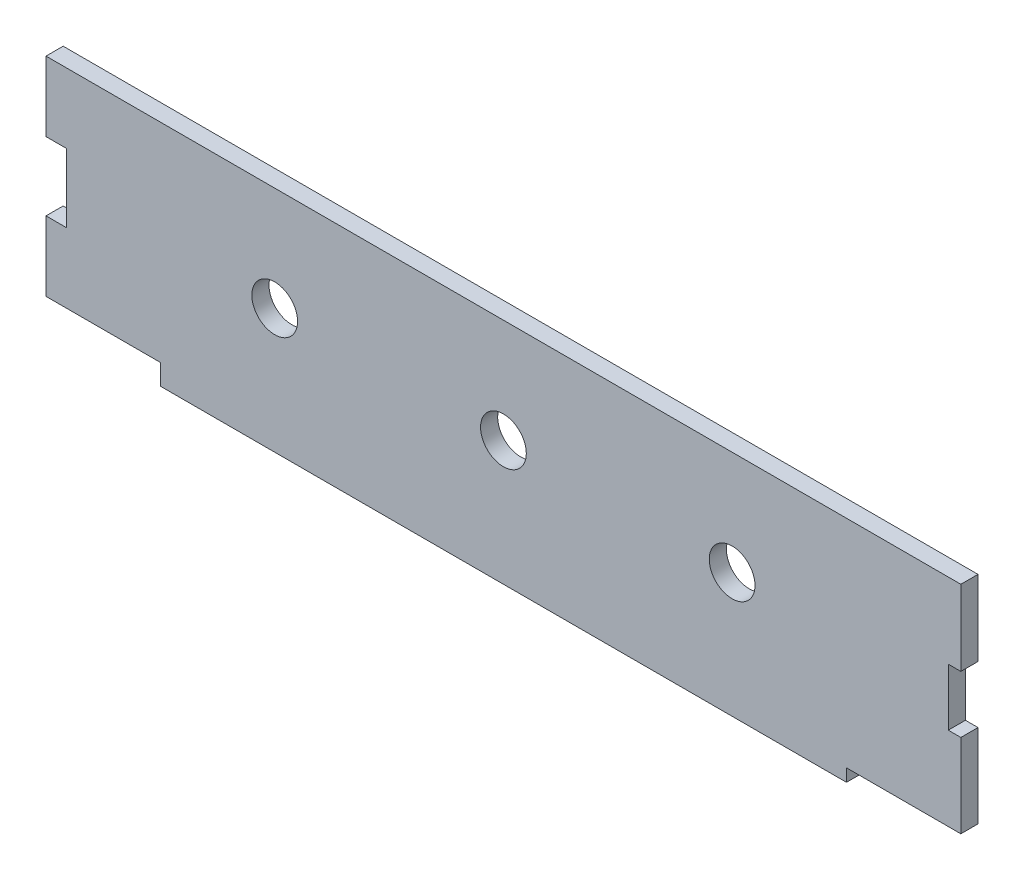
ISO-10303-21;
HEADER;
FILE_DESCRIPTION(('STEP AP214'),'2;1');
FILE_NAME('part.step','',(''),(''),'','','');
FILE_SCHEMA(('AUTOMOTIVE_DESIGN { 1 0 10303 214 1 1 1 1 }'));
ENDSEC;
DATA;
#1=APPLICATION_CONTEXT('core data for automotive mechanical design processes');
#2=APPLICATION_PROTOCOL_DEFINITION('international standard','automotive_design',2000,#1);
#3=PRODUCT_CONTEXT('',#1,'mechanical');
#4=PRODUCT('Part','Part','',(#3));
#5=PRODUCT_RELATED_PRODUCT_CATEGORY('part','',(#4));
#6=PRODUCT_DEFINITION_FORMATION('','',#4);
#7=PRODUCT_DEFINITION_CONTEXT('part definition',#1,'design');
#8=PRODUCT_DEFINITION('design','',#6,#7);
#9=PRODUCT_DEFINITION_SHAPE('','',#8);
#10=(LENGTH_UNIT() NAMED_UNIT(*) SI_UNIT(.MILLI.,.METRE.));
#11=(NAMED_UNIT(*) PLANE_ANGLE_UNIT() SI_UNIT($,.RADIAN.));
#12=(NAMED_UNIT(*) SI_UNIT($,.STERADIAN.) SOLID_ANGLE_UNIT());
#13=UNCERTAINTY_MEASURE_WITH_UNIT(LENGTH_MEASURE(1.E-05),#10,'distance_accuracy_value','');
#14=(GEOMETRIC_REPRESENTATION_CONTEXT(3) GLOBAL_UNCERTAINTY_ASSIGNED_CONTEXT((#13)) GLOBAL_UNIT_ASSIGNED_CONTEXT((#10,
#11,#12)) REPRESENTATION_CONTEXT('',''));
#15=CARTESIAN_POINT('',(0.,0.,0.));
#16=DIRECTION('',(0.,0.,1.));
#17=DIRECTION('',(1.,0.,0.));
#18=AXIS2_PLACEMENT_3D('',#15,#16,#17);
#19=CARTESIAN_POINT('',(0.,0.,1.5));
#20=DIRECTION('',(0.,0.,-1.));
#21=DIRECTION('',(-1.,0.,0.));
#22=AXIS2_PLACEMENT_3D('',#19,#20,#21);
#23=PLANE('',#22);
#24=DIRECTION('',(0.,-1.,0.));
#25=VECTOR('',#24,1.);
#26=CARTESIAN_POINT('',(-40.,2.99999999999999,1.5));
#27=LINE('',#26,#25);
#28=CARTESIAN_POINT('',(-40.0000000000001,9.09999999999999,1.5));
#29=VERTEX_POINT('',#28);
#30=CARTESIAN_POINT('',(-40.,2.99999999999999,1.5));
#31=VERTEX_POINT('',#30);
#32=EDGE_CURVE('E209',#29,#31,#27,.T.);
#33=ORIENTED_EDGE('',*,*,#32,.T.);
#34=DIRECTION('',(1.,0.,0.));
#35=VECTOR('',#34,1.);
#36=CARTESIAN_POINT('',(-38.2,2.99999999999999,1.5));
#37=LINE('',#36,#35);
#38=CARTESIAN_POINT('',(-38.2,2.99999999999999,1.5));
#39=VERTEX_POINT('',#38);
#40=EDGE_CURVE('E117',#31,#39,#37,.T.);
#41=ORIENTED_EDGE('',*,*,#40,.T.);
#42=DIRECTION('',(0.,-1.,0.));
#43=VECTOR('',#42,1.);
#44=CARTESIAN_POINT('',(-38.2,-3.00000000000001,1.5));
#45=LINE('',#44,#43);
#46=CARTESIAN_POINT('',(-38.2,-3.00000000000001,1.5));
#47=VERTEX_POINT('',#46);
#48=EDGE_CURVE('E248',#39,#47,#45,.T.);
#49=ORIENTED_EDGE('',*,*,#48,.T.);
#50=DIRECTION('',(-1.,0.,0.));
#51=VECTOR('',#50,1.);
#52=CARTESIAN_POINT('',(-40.,-3.,1.5));
#53=LINE('',#52,#51);
#54=CARTESIAN_POINT('',(-40.,-3.,1.5));
#55=VERTEX_POINT('',#54);
#56=EDGE_CURVE('E267',#47,#55,#53,.T.);
#57=ORIENTED_EDGE('',*,*,#56,.T.);
#58=DIRECTION('',(0.,-1.,0.));
#59=VECTOR('',#58,1.);
#60=CARTESIAN_POINT('',(-40.,-9.1,1.5));
#61=LINE('',#60,#59);
#62=CARTESIAN_POINT('',(-40.,-9.1,1.5));
#63=VERTEX_POINT('',#62);
#64=EDGE_CURVE('E264',#55,#63,#61,.T.);
#65=ORIENTED_EDGE('',*,*,#64,.T.);
#66=DIRECTION('',(1.,0.,0.));
#67=VECTOR('',#66,1.);
#68=CARTESIAN_POINT('',(-30.,-9.1,1.5));
#69=LINE('',#68,#67);
#70=CARTESIAN_POINT('',(-30.,-9.1,1.5));
#71=VERTEX_POINT('',#70);
#72=EDGE_CURVE('E266',#63,#71,#69,.T.);
#73=ORIENTED_EDGE('',*,*,#72,.T.);
#74=DIRECTION('',(0.,-1.,0.));
#75=VECTOR('',#74,1.);
#76=CARTESIAN_POINT('',(-30.,-10.9,1.5));
#77=LINE('',#76,#75);
#78=CARTESIAN_POINT('',(-30.,-10.9,1.5));
#79=VERTEX_POINT('',#78);
#80=EDGE_CURVE('E269',#71,#79,#77,.T.);
#81=ORIENTED_EDGE('',*,*,#80,.T.);
#82=DIRECTION('',(1.,0.,0.));
#83=VECTOR('',#82,1.);
#84=CARTESIAN_POINT('',(30.,-10.9,1.5));
#85=LINE('',#84,#83);
#86=CARTESIAN_POINT('',(30.,-10.9,1.5));
#87=VERTEX_POINT('',#86);
#88=EDGE_CURVE('E275',#79,#87,#85,.T.);
#89=ORIENTED_EDGE('',*,*,#88,.T.);
#90=DIRECTION('',(0.,1.,0.));
#91=VECTOR('',#90,1.);
#92=CARTESIAN_POINT('',(30.,-9.79999999999999,1.5));
#93=LINE('',#92,#91);
#94=CARTESIAN_POINT('',(30.,-9.79999999999999,1.5));
#95=VERTEX_POINT('',#94);
#96=EDGE_CURVE('E277',#87,#95,#93,.T.);
#97=ORIENTED_EDGE('',*,*,#96,.T.);
#98=DIRECTION('',(1.,0.,0.));
#99=VECTOR('',#98,1.);
#100=CARTESIAN_POINT('',(40.,-9.79999999999999,1.5));
#101=LINE('',#100,#99);
#102=CARTESIAN_POINT('',(40.,-9.79999999999999,1.5));
#103=VERTEX_POINT('',#102);
#104=EDGE_CURVE('E279',#95,#103,#101,.T.);
#105=ORIENTED_EDGE('',*,*,#104,.T.);
#106=DIRECTION('',(0.,1.,0.));
#107=VECTOR('',#106,1.);
#108=CARTESIAN_POINT('',(40.,-2.5,1.5));
#109=LINE('',#108,#107);
#110=CARTESIAN_POINT('',(40.,-2.5,1.5));
#111=VERTEX_POINT('',#110);
#112=EDGE_CURVE('E281',#103,#111,#109,.T.);
#113=ORIENTED_EDGE('',*,*,#112,.T.);
#114=DIRECTION('',(-1.,0.,0.));
#115=VECTOR('',#114,1.);
#116=CARTESIAN_POINT('',(38.9,-2.5,1.5));
#117=LINE('',#116,#115);
#118=CARTESIAN_POINT('',(38.9,-2.5,1.5));
#119=VERTEX_POINT('',#118);
#120=EDGE_CURVE('E283',#111,#119,#117,.T.);
#121=ORIENTED_EDGE('',*,*,#120,.T.);
#122=DIRECTION('',(0.,1.,0.));
#123=VECTOR('',#122,1.);
#124=CARTESIAN_POINT('',(38.9,2.5,1.5));
#125=LINE('',#124,#123);
#126=CARTESIAN_POINT('',(38.9,2.5,1.5));
#127=VERTEX_POINT('',#126);
#128=EDGE_CURVE('E160',#119,#127,#125,.T.);
#129=ORIENTED_EDGE('',*,*,#128,.T.);
#130=DIRECTION('',(1.,0.,0.));
#131=VECTOR('',#130,1.);
#132=CARTESIAN_POINT('',(40.,2.5,1.5));
#133=LINE('',#132,#131);
#134=CARTESIAN_POINT('',(40.,2.5,1.5));
#135=VERTEX_POINT('',#134);
#136=EDGE_CURVE('E154',#127,#135,#133,.T.);
#137=ORIENTED_EDGE('',*,*,#136,.T.);
#138=DIRECTION('',(0.,1.,0.));
#139=VECTOR('',#138,1.);
#140=CARTESIAN_POINT('',(40.0000000000001,9.09999999999999,1.5));
#141=LINE('',#140,#139);
#142=CARTESIAN_POINT('',(40.0000000000001,9.09999999999999,1.5));
#143=VERTEX_POINT('',#142);
#144=EDGE_CURVE('E158',#135,#143,#141,.T.);
#145=ORIENTED_EDGE('',*,*,#144,.T.);
#146=DIRECTION('',(-1.,0.,0.));
#147=VECTOR('',#146,1.);
#148=CARTESIAN_POINT('',(-40.0000000000001,9.09999999999999,1.5));
#149=LINE('',#148,#147);
#150=EDGE_CURVE('E50',#143,#29,#149,.T.);
#151=ORIENTED_EDGE('',*,*,#150,.T.);
#152=EDGE_LOOP('',(#33,#41,#49,#57,#65,#73,#81,#89,#97,#105,#113,#121,#129,#137,#145,#151));
#153=FACE_BOUND('',#152,.T.);
#154=CARTESIAN_POINT('',(20.,0.,1.5));
#155=DIRECTION('',(0.,0.,1.));
#156=DIRECTION('',(1.,0.,0.));
#157=AXIS2_PLACEMENT_3D('',#154,#155,#156);
#158=CIRCLE('',#157,2.00000000000003);
#159=CARTESIAN_POINT('',(22.,0.,1.5));
#160=VERTEX_POINT('',#159);
#161=EDGE_CURVE('E182',#160,#160,#158,.T.);
#162=ORIENTED_EDGE('',*,*,#161,.F.);
#163=EDGE_LOOP('',(#162));
#164=FACE_BOUND('',#163,.T.);
#165=CARTESIAN_POINT('',(0.,0.,1.5));
#166=DIRECTION('',(0.,0.,1.));
#167=DIRECTION('',(1.,0.,0.));
#168=AXIS2_PLACEMENT_3D('',#165,#166,#167);
#169=CIRCLE('',#168,2.00000000000002);
#170=CARTESIAN_POINT('',(2.,0.,1.5));
#171=VERTEX_POINT('',#170);
#172=EDGE_CURVE('E337',#171,#171,#169,.T.);
#173=ORIENTED_EDGE('',*,*,#172,.F.);
#174=EDGE_LOOP('',(#173));
#175=FACE_BOUND('',#174,.T.);
#176=CARTESIAN_POINT('',(-20.,0.,1.5));
#177=DIRECTION('',(0.,0.,1.));
#178=DIRECTION('',(1.,0.,0.));
#179=AXIS2_PLACEMENT_3D('',#176,#177,#178);
#180=CIRCLE('',#179,2.00000000000003);
#181=CARTESIAN_POINT('',(-18.,0.,1.5));
#182=VERTEX_POINT('',#181);
#183=EDGE_CURVE('E328',#182,#182,#180,.T.);
#184=ORIENTED_EDGE('',*,*,#183,.F.);
#185=EDGE_LOOP('',(#184));
#186=FACE_BOUND('',#185,.T.);
#187=ADVANCED_FACE('F33',(#153,#164,#175,#186),#23,.F.);
#188=CARTESIAN_POINT('',(0.,0.,0.));
#189=DIRECTION('',(0.,0.,-1.));
#190=DIRECTION('',(-1.,0.,0.));
#191=AXIS2_PLACEMENT_3D('',#188,#189,#190);
#192=PLANE('',#191);
#193=CARTESIAN_POINT('',(0.,0.,0.));
#194=DIRECTION('',(0.,0.,1.));
#195=DIRECTION('',(1.,0.,0.));
#196=AXIS2_PLACEMENT_3D('',#193,#194,#195);
#197=CIRCLE('',#196,2.00000000000002);
#198=CARTESIAN_POINT('',(2.,0.,0.));
#199=VERTEX_POINT('',#198);
#200=EDGE_CURVE('E334',#199,#199,#197,.T.);
#201=ORIENTED_EDGE('',*,*,#200,.T.);
#202=EDGE_LOOP('',(#201));
#203=FACE_BOUND('',#202,.T.);
#204=DIRECTION('',(0.,-1.,0.));
#205=VECTOR('',#204,1.);
#206=CARTESIAN_POINT('',(-40.,2.99999999999999,0.));
#207=LINE('',#206,#205);
#208=CARTESIAN_POINT('',(-40.0000000000001,9.09999999999999,0.));
#209=VERTEX_POINT('',#208);
#210=CARTESIAN_POINT('',(-40.,2.99999999999999,0.));
#211=VERTEX_POINT('',#210);
#212=EDGE_CURVE('E178',#209,#211,#207,.T.);
#213=ORIENTED_EDGE('',*,*,#212,.F.);
#214=DIRECTION('',(-1.,0.,0.));
#215=VECTOR('',#214,1.);
#216=CARTESIAN_POINT('',(-40.0000000000001,9.09999999999999,0.));
#217=LINE('',#216,#215);
#218=CARTESIAN_POINT('',(40.0000000000001,9.09999999999999,0.));
#219=VERTEX_POINT('',#218);
#220=EDGE_CURVE('E109',#219,#209,#217,.T.);
#221=ORIENTED_EDGE('',*,*,#220,.F.);
#222=DIRECTION('',(0.,1.,0.));
#223=VECTOR('',#222,1.);
#224=CARTESIAN_POINT('',(40.0000000000001,9.09999999999999,0.));
#225=LINE('',#224,#223);
#226=CARTESIAN_POINT('',(40.,2.5,0.));
#227=VERTEX_POINT('',#226);
#228=EDGE_CURVE('E103',#227,#219,#225,.T.);
#229=ORIENTED_EDGE('',*,*,#228,.F.);
#230=DIRECTION('',(1.,0.,0.));
#231=VECTOR('',#230,1.);
#232=CARTESIAN_POINT('',(40.,2.5,0.));
#233=LINE('',#232,#231);
#234=CARTESIAN_POINT('',(38.9,2.5,0.));
#235=VERTEX_POINT('',#234);
#236=EDGE_CURVE('E168',#235,#227,#233,.T.);
#237=ORIENTED_EDGE('',*,*,#236,.F.);
#238=DIRECTION('',(0.,1.,0.));
#239=VECTOR('',#238,1.);
#240=CARTESIAN_POINT('',(38.9,2.5,0.));
#241=LINE('',#240,#239);
#242=CARTESIAN_POINT('',(38.9,-2.5,0.));
#243=VERTEX_POINT('',#242);
#244=EDGE_CURVE('E204',#243,#235,#241,.T.);
#245=ORIENTED_EDGE('',*,*,#244,.F.);
#246=DIRECTION('',(-1.,0.,0.));
#247=VECTOR('',#246,1.);
#248=CARTESIAN_POINT('',(38.9,-2.5,0.));
#249=LINE('',#248,#247);
#250=CARTESIAN_POINT('',(40.,-2.5,0.));
#251=VERTEX_POINT('',#250);
#252=EDGE_CURVE('E202',#251,#243,#249,.T.);
#253=ORIENTED_EDGE('',*,*,#252,.F.);
#254=DIRECTION('',(0.,1.,0.));
#255=VECTOR('',#254,1.);
#256=CARTESIAN_POINT('',(40.,-2.5,0.));
#257=LINE('',#256,#255);
#258=CARTESIAN_POINT('',(40.,-9.79999999999999,0.));
#259=VERTEX_POINT('',#258);
#260=EDGE_CURVE('E200',#259,#251,#257,.T.);
#261=ORIENTED_EDGE('',*,*,#260,.F.);
#262=DIRECTION('',(1.,0.,0.));
#263=VECTOR('',#262,1.);
#264=CARTESIAN_POINT('',(40.,-9.79999999999999,0.));
#265=LINE('',#264,#263);
#266=CARTESIAN_POINT('',(30.,-9.79999999999999,0.));
#267=VERTEX_POINT('',#266);
#268=EDGE_CURVE('E198',#267,#259,#265,.T.);
#269=ORIENTED_EDGE('',*,*,#268,.F.);
#270=DIRECTION('',(0.,1.,0.));
#271=VECTOR('',#270,1.);
#272=CARTESIAN_POINT('',(30.,-9.79999999999999,0.));
#273=LINE('',#272,#271);
#274=CARTESIAN_POINT('',(30.,-10.9,0.));
#275=VERTEX_POINT('',#274);
#276=EDGE_CURVE('E196',#275,#267,#273,.T.);
#277=ORIENTED_EDGE('',*,*,#276,.F.);
#278=DIRECTION('',(1.,0.,0.));
#279=VECTOR('',#278,1.);
#280=CARTESIAN_POINT('',(30.,-10.9,0.));
#281=LINE('',#280,#279);
#282=CARTESIAN_POINT('',(-30.,-10.9,0.));
#283=VERTEX_POINT('',#282);
#284=EDGE_CURVE('E194',#283,#275,#281,.T.);
#285=ORIENTED_EDGE('',*,*,#284,.F.);
#286=DIRECTION('',(0.,-1.,0.));
#287=VECTOR('',#286,1.);
#288=CARTESIAN_POINT('',(-30.,-10.9,0.));
#289=LINE('',#288,#287);
#290=CARTESIAN_POINT('',(-30.,-9.1,0.));
#291=VERTEX_POINT('',#290);
#292=EDGE_CURVE('E192',#291,#283,#289,.T.);
#293=ORIENTED_EDGE('',*,*,#292,.F.);
#294=DIRECTION('',(1.,0.,0.));
#295=VECTOR('',#294,1.);
#296=CARTESIAN_POINT('',(-30.,-9.1,0.));
#297=LINE('',#296,#295);
#298=CARTESIAN_POINT('',(-40.,-9.1,0.));
#299=VERTEX_POINT('',#298);
#300=EDGE_CURVE('E190',#299,#291,#297,.T.);
#301=ORIENTED_EDGE('',*,*,#300,.F.);
#302=DIRECTION('',(0.,-1.,0.));
#303=VECTOR('',#302,1.);
#304=CARTESIAN_POINT('',(-40.,-9.1,0.));
#305=LINE('',#304,#303);
#306=CARTESIAN_POINT('',(-40.,-3.,0.));
#307=VERTEX_POINT('',#306);
#308=EDGE_CURVE('E188',#307,#299,#305,.T.);
#309=ORIENTED_EDGE('',*,*,#308,.F.);
#310=DIRECTION('',(-1.,0.,0.));
#311=VECTOR('',#310,1.);
#312=CARTESIAN_POINT('',(-40.,-3.,0.));
#313=LINE('',#312,#311);
#314=CARTESIAN_POINT('',(-38.2,-3.00000000000001,0.));
#315=VERTEX_POINT('',#314);
#316=EDGE_CURVE('E186',#315,#307,#313,.T.);
#317=ORIENTED_EDGE('',*,*,#316,.F.);
#318=DIRECTION('',(0.,-1.,0.));
#319=VECTOR('',#318,1.);
#320=CARTESIAN_POINT('',(-38.2,-3.00000000000001,0.));
#321=LINE('',#320,#319);
#322=CARTESIAN_POINT('',(-38.2,2.99999999999999,0.));
#323=VERTEX_POINT('',#322);
#324=EDGE_CURVE('E184',#323,#315,#321,.T.);
#325=ORIENTED_EDGE('',*,*,#324,.F.);
#326=DIRECTION('',(1.,0.,0.));
#327=VECTOR('',#326,1.);
#328=CARTESIAN_POINT('',(-38.2,2.99999999999999,0.));
#329=LINE('',#328,#327);
#330=EDGE_CURVE('E181',#211,#323,#329,.T.);
#331=ORIENTED_EDGE('',*,*,#330,.F.);
#332=EDGE_LOOP('',(#213,#221,#229,#237,#245,#253,#261,#269,#277,#285,#293,#301,#309,#317,#325,#331));
#333=FACE_BOUND('',#332,.T.);
#334=CARTESIAN_POINT('',(20.,0.,0.));
#335=DIRECTION('',(0.,0.,1.));
#336=DIRECTION('',(1.,0.,0.));
#337=AXIS2_PLACEMENT_3D('',#334,#335,#336);
#338=CIRCLE('',#337,2.00000000000003);
#339=CARTESIAN_POINT('',(22.,0.,0.));
#340=VERTEX_POINT('',#339);
#341=EDGE_CURVE('E340',#340,#340,#338,.T.);
#342=ORIENTED_EDGE('',*,*,#341,.T.);
#343=EDGE_LOOP('',(#342));
#344=FACE_BOUND('',#343,.T.);
#345=CARTESIAN_POINT('',(-20.,0.,0.));
#346=DIRECTION('',(0.,0.,1.));
#347=DIRECTION('',(1.,0.,0.));
#348=AXIS2_PLACEMENT_3D('',#345,#346,#347);
#349=CIRCLE('',#348,2.00000000000003);
#350=CARTESIAN_POINT('',(-18.,0.,0.));
#351=VERTEX_POINT('',#350);
#352=EDGE_CURVE('E331',#351,#351,#349,.T.);
#353=ORIENTED_EDGE('',*,*,#352,.T.);
#354=EDGE_LOOP('',(#353));
#355=FACE_BOUND('',#354,.T.);
#356=ADVANCED_FACE('F252',(#203,#333,#344,#355),#192,.T.);
#357=CARTESIAN_POINT('',(-40.,2.99999999999999,1.5));
#358=DIRECTION('',(1.,0.,0.));
#359=DIRECTION('',(0.,1.,0.));
#360=AXIS2_PLACEMENT_3D('',#357,#358,#359);
#361=PLANE('',#360);
#362=ORIENTED_EDGE('',*,*,#212,.T.);
#363=DIRECTION('',(0.,0.,-1.));
#364=VECTOR('',#363,1.);
#365=CARTESIAN_POINT('',(-40.,2.99999999999999,1.5));
#366=LINE('',#365,#364);
#367=EDGE_CURVE('E11',#31,#211,#366,.T.);
#368=ORIENTED_EDGE('',*,*,#367,.F.);
#369=ORIENTED_EDGE('',*,*,#32,.F.);
#370=DIRECTION('',(0.,0.,-1.));
#371=VECTOR('',#370,1.);
#372=CARTESIAN_POINT('',(-40.0000000000001,9.09999999999999,1.5));
#373=LINE('',#372,#371);
#374=EDGE_CURVE('E174',#29,#209,#373,.T.);
#375=ORIENTED_EDGE('',*,*,#374,.T.);
#376=EDGE_LOOP('',(#362,#368,#369,#375));
#377=FACE_BOUND('',#376,.T.);
#378=ADVANCED_FACE('F35',(#377),#361,.F.);
#379=CARTESIAN_POINT('',(-38.2,2.99999999999999,1.5));
#380=DIRECTION('',(0.,1.,0.));
#381=DIRECTION('',(-1.,0.,0.));
#382=AXIS2_PLACEMENT_3D('',#379,#380,#381);
#383=PLANE('',#382);
#384=ORIENTED_EDGE('',*,*,#330,.T.);
#385=DIRECTION('',(0.,0.,-1.));
#386=VECTOR('',#385,1.);
#387=CARTESIAN_POINT('',(-38.2,2.99999999999999,1.5));
#388=LINE('',#387,#386);
#389=EDGE_CURVE('E42',#39,#323,#388,.T.);
#390=ORIENTED_EDGE('',*,*,#389,.F.);
#391=ORIENTED_EDGE('',*,*,#40,.F.);
#392=ORIENTED_EDGE('',*,*,#367,.T.);
#393=EDGE_LOOP('',(#384,#390,#391,#392));
#394=FACE_BOUND('',#393,.T.);
#395=ADVANCED_FACE('F483',(#394),#383,.F.);
#396=CARTESIAN_POINT('',(-38.2,-3.00000000000001,1.5));
#397=DIRECTION('',(1.,0.,0.));
#398=DIRECTION('',(0.,0.,-1.));
#399=AXIS2_PLACEMENT_3D('',#396,#397,#398);
#400=PLANE('',#399);
#401=ORIENTED_EDGE('',*,*,#324,.T.);
#402=DIRECTION('',(0.,0.,-1.));
#403=VECTOR('',#402,1.);
#404=CARTESIAN_POINT('',(-38.2,-3.00000000000001,1.5));
#405=LINE('',#404,#403);
#406=EDGE_CURVE('E240',#47,#315,#405,.T.);
#407=ORIENTED_EDGE('',*,*,#406,.F.);
#408=ORIENTED_EDGE('',*,*,#48,.F.);
#409=ORIENTED_EDGE('',*,*,#389,.T.);
#410=EDGE_LOOP('',(#401,#407,#408,#409));
#411=FACE_BOUND('',#410,.T.);
#412=ADVANCED_FACE('F246',(#411),#400,.F.);
#413=CARTESIAN_POINT('',(-40.,-3.,1.5));
#414=DIRECTION('',(0.,-1.,0.));
#415=DIRECTION('',(1.,0.,0.));
#416=AXIS2_PLACEMENT_3D('',#413,#414,#415);
#417=PLANE('',#416);
#418=ORIENTED_EDGE('',*,*,#316,.T.);
#419=DIRECTION('',(0.,0.,-1.));
#420=VECTOR('',#419,1.);
#421=CARTESIAN_POINT('',(-40.,-3.,1.5));
#422=LINE('',#421,#420);
#423=EDGE_CURVE('E237',#55,#307,#422,.T.);
#424=ORIENTED_EDGE('',*,*,#423,.F.);
#425=ORIENTED_EDGE('',*,*,#56,.F.);
#426=ORIENTED_EDGE('',*,*,#406,.T.);
#427=EDGE_LOOP('',(#418,#424,#425,#426));
#428=FACE_BOUND('',#427,.T.);
#429=ADVANCED_FACE('F258',(#428),#417,.F.);
#430=CARTESIAN_POINT('',(-40.,-9.1,1.5));
#431=DIRECTION('',(1.,0.,0.));
#432=DIRECTION('',(0.,1.,0.));
#433=AXIS2_PLACEMENT_3D('',#430,#431,#432);
#434=PLANE('',#433);
#435=ORIENTED_EDGE('',*,*,#308,.T.);
#436=DIRECTION('',(0.,0.,-1.));
#437=VECTOR('',#436,1.);
#438=CARTESIAN_POINT('',(-40.,-9.1,1.5));
#439=LINE('',#438,#437);
#440=EDGE_CURVE('E234',#63,#299,#439,.T.);
#441=ORIENTED_EDGE('',*,*,#440,.F.);
#442=ORIENTED_EDGE('',*,*,#64,.F.);
#443=ORIENTED_EDGE('',*,*,#423,.T.);
#444=EDGE_LOOP('',(#435,#441,#442,#443));
#445=FACE_BOUND('',#444,.T.);
#446=ADVANCED_FACE('F262',(#445),#434,.F.);
#447=CARTESIAN_POINT('',(-30.,-9.1,1.5));
#448=DIRECTION('',(0.,1.,0.));
#449=DIRECTION('',(-1.,0.,0.));
#450=AXIS2_PLACEMENT_3D('',#447,#448,#449);
#451=PLANE('',#450);
#452=ORIENTED_EDGE('',*,*,#300,.T.);
#453=DIRECTION('',(0.,0.,-1.));
#454=VECTOR('',#453,1.);
#455=CARTESIAN_POINT('',(-30.,-9.1,1.5));
#456=LINE('',#455,#454);
#457=EDGE_CURVE('E231',#71,#291,#456,.T.);
#458=ORIENTED_EDGE('',*,*,#457,.F.);
#459=ORIENTED_EDGE('',*,*,#72,.F.);
#460=ORIENTED_EDGE('',*,*,#440,.T.);
#461=EDGE_LOOP('',(#452,#458,#459,#460));
#462=FACE_BOUND('',#461,.T.);
#463=ADVANCED_FACE('F448',(#462),#451,.F.);
#464=CARTESIAN_POINT('',(-30.,-10.9,1.5));
#465=DIRECTION('',(1.,0.,0.));
#466=DIRECTION('',(0.,1.,0.));
#467=AXIS2_PLACEMENT_3D('',#464,#465,#466);
#468=PLANE('',#467);
#469=ORIENTED_EDGE('',*,*,#292,.T.);
#470=DIRECTION('',(0.,0.,-1.));
#471=VECTOR('',#470,1.);
#472=CARTESIAN_POINT('',(-30.,-10.9,1.5));
#473=LINE('',#472,#471);
#474=EDGE_CURVE('E228',#79,#283,#473,.T.);
#475=ORIENTED_EDGE('',*,*,#474,.F.);
#476=ORIENTED_EDGE('',*,*,#80,.F.);
#477=ORIENTED_EDGE('',*,*,#457,.T.);
#478=EDGE_LOOP('',(#469,#475,#476,#477));
#479=FACE_BOUND('',#478,.T.);
#480=ADVANCED_FACE('F438',(#479),#468,.F.);
#481=CARTESIAN_POINT('',(30.,-10.9,1.5));
#482=DIRECTION('',(0.,1.,0.));
#483=DIRECTION('',(-1.,0.,0.));
#484=AXIS2_PLACEMENT_3D('',#481,#482,#483);
#485=PLANE('',#484);
#486=ORIENTED_EDGE('',*,*,#284,.T.);
#487=DIRECTION('',(0.,0.,-1.));
#488=VECTOR('',#487,1.);
#489=CARTESIAN_POINT('',(30.,-10.9,1.5));
#490=LINE('',#489,#488);
#491=EDGE_CURVE('E225',#87,#275,#490,.T.);
#492=ORIENTED_EDGE('',*,*,#491,.F.);
#493=ORIENTED_EDGE('',*,*,#88,.F.);
#494=ORIENTED_EDGE('',*,*,#474,.T.);
#495=EDGE_LOOP('',(#486,#492,#493,#494));
#496=FACE_BOUND('',#495,.T.);
#497=ADVANCED_FACE('F428',(#496),#485,.F.);
#498=CARTESIAN_POINT('',(30.,-9.79999999999999,1.5));
#499=DIRECTION('',(-1.,0.,0.));
#500=DIRECTION('',(0.,0.,1.));
#501=AXIS2_PLACEMENT_3D('',#498,#499,#500);
#502=PLANE('',#501);
#503=ORIENTED_EDGE('',*,*,#276,.T.);
#504=DIRECTION('',(0.,0.,-1.));
#505=VECTOR('',#504,1.);
#506=CARTESIAN_POINT('',(30.,-9.79999999999999,1.5));
#507=LINE('',#506,#505);
#508=EDGE_CURVE('E222',#95,#267,#507,.T.);
#509=ORIENTED_EDGE('',*,*,#508,.F.);
#510=ORIENTED_EDGE('',*,*,#96,.F.);
#511=ORIENTED_EDGE('',*,*,#491,.T.);
#512=EDGE_LOOP('',(#503,#509,#510,#511));
#513=FACE_BOUND('',#512,.T.);
#514=ADVANCED_FACE('F418',(#513),#502,.F.);
#515=CARTESIAN_POINT('',(40.,-9.79999999999999,1.5));
#516=DIRECTION('',(0.,1.,0.));
#517=DIRECTION('',(-1.,0.,0.));
#518=AXIS2_PLACEMENT_3D('',#515,#516,#517);
#519=PLANE('',#518);
#520=ORIENTED_EDGE('',*,*,#268,.T.);
#521=DIRECTION('',(0.,0.,-1.));
#522=VECTOR('',#521,1.);
#523=CARTESIAN_POINT('',(40.,-9.79999999999999,1.5));
#524=LINE('',#523,#522);
#525=EDGE_CURVE('E219',#103,#259,#524,.T.);
#526=ORIENTED_EDGE('',*,*,#525,.F.);
#527=ORIENTED_EDGE('',*,*,#104,.F.);
#528=ORIENTED_EDGE('',*,*,#508,.T.);
#529=EDGE_LOOP('',(#520,#526,#527,#528));
#530=FACE_BOUND('',#529,.T.);
#531=ADVANCED_FACE('F408',(#530),#519,.F.);
#532=CARTESIAN_POINT('',(40.,-2.5,1.5));
#533=DIRECTION('',(-1.,0.,0.));
#534=DIRECTION('',(0.,-1.,0.));
#535=AXIS2_PLACEMENT_3D('',#532,#533,#534);
#536=PLANE('',#535);
#537=ORIENTED_EDGE('',*,*,#260,.T.);
#538=DIRECTION('',(0.,0.,-1.));
#539=VECTOR('',#538,1.);
#540=CARTESIAN_POINT('',(40.,-2.5,1.5));
#541=LINE('',#540,#539);
#542=EDGE_CURVE('E216',#111,#251,#541,.T.);
#543=ORIENTED_EDGE('',*,*,#542,.F.);
#544=ORIENTED_EDGE('',*,*,#112,.F.);
#545=ORIENTED_EDGE('',*,*,#525,.T.);
#546=EDGE_LOOP('',(#537,#543,#544,#545));
#547=FACE_BOUND('',#546,.T.);
#548=ADVANCED_FACE('F399',(#547),#536,.F.);
#549=CARTESIAN_POINT('',(38.9,-2.5,1.5));
#550=DIRECTION('',(0.,-1.,0.));
#551=DIRECTION('',(0.,0.,-1.));
#552=AXIS2_PLACEMENT_3D('',#549,#550,#551);
#553=PLANE('',#552);
#554=ORIENTED_EDGE('',*,*,#252,.T.);
#555=DIRECTION('',(0.,0.,-1.));
#556=VECTOR('',#555,1.);
#557=CARTESIAN_POINT('',(38.9,-2.5,1.5));
#558=LINE('',#557,#556);
#559=EDGE_CURVE('E213',#119,#243,#558,.T.);
#560=ORIENTED_EDGE('',*,*,#559,.F.);
#561=ORIENTED_EDGE('',*,*,#120,.F.);
#562=ORIENTED_EDGE('',*,*,#542,.T.);
#563=EDGE_LOOP('',(#554,#560,#561,#562));
#564=FACE_BOUND('',#563,.T.);
#565=ADVANCED_FACE('F289',(#564),#553,.F.);
#566=CARTESIAN_POINT('',(38.9,2.5,1.5));
#567=DIRECTION('',(-1.,0.,0.));
#568=DIRECTION('',(0.,0.,1.));
#569=AXIS2_PLACEMENT_3D('',#566,#567,#568);
#570=PLANE('',#569);
#571=ORIENTED_EDGE('',*,*,#244,.T.);
#572=DIRECTION('',(0.,0.,-1.));
#573=VECTOR('',#572,1.);
#574=CARTESIAN_POINT('',(38.9,2.5,1.5));
#575=LINE('',#574,#573);
#576=EDGE_CURVE('E169',#127,#235,#575,.T.);
#577=ORIENTED_EDGE('',*,*,#576,.F.);
#578=ORIENTED_EDGE('',*,*,#128,.F.);
#579=ORIENTED_EDGE('',*,*,#559,.T.);
#580=EDGE_LOOP('',(#571,#577,#578,#579));
#581=FACE_BOUND('',#580,.T.);
#582=ADVANCED_FACE('F293',(#581),#570,.F.);
#583=CARTESIAN_POINT('',(40.,2.5,1.5));
#584=DIRECTION('',(0.,1.,0.));
#585=DIRECTION('',(0.,0.,1.));
#586=AXIS2_PLACEMENT_3D('',#583,#584,#585);
#587=PLANE('',#586);
#588=ORIENTED_EDGE('',*,*,#236,.T.);
#589=DIRECTION('',(0.,0.,-1.));
#590=VECTOR('',#589,1.);
#591=CARTESIAN_POINT('',(40.,2.5,1.5));
#592=LINE('',#591,#590);
#593=EDGE_CURVE('E165',#135,#227,#592,.T.);
#594=ORIENTED_EDGE('',*,*,#593,.F.);
#595=ORIENTED_EDGE('',*,*,#136,.F.);
#596=ORIENTED_EDGE('',*,*,#576,.T.);
#597=EDGE_LOOP('',(#588,#594,#595,#596));
#598=FACE_BOUND('',#597,.T.);
#599=ADVANCED_FACE('F166',(#598),#587,.F.);
#600=CARTESIAN_POINT('',(40.0000000000001,9.09999999999999,1.5));
#601=DIRECTION('',(-1.,0.,0.));
#602=DIRECTION('',(0.,-1.,0.));
#603=AXIS2_PLACEMENT_3D('',#600,#601,#602);
#604=PLANE('',#603);
#605=ORIENTED_EDGE('',*,*,#228,.T.);
#606=DIRECTION('',(0.,0.,-1.));
#607=VECTOR('',#606,1.);
#608=CARTESIAN_POINT('',(40.0000000000001,9.09999999999999,1.5));
#609=LINE('',#608,#607);
#610=EDGE_CURVE('E170',#143,#219,#609,.T.);
#611=ORIENTED_EDGE('',*,*,#610,.F.);
#612=ORIENTED_EDGE('',*,*,#144,.F.);
#613=ORIENTED_EDGE('',*,*,#593,.T.);
#614=EDGE_LOOP('',(#605,#611,#612,#613));
#615=FACE_BOUND('',#614,.T.);
#616=ADVANCED_FACE('F172',(#615),#604,.F.);
#617=CARTESIAN_POINT('',(-40.0000000000001,9.09999999999999,1.5));
#618=DIRECTION('',(0.,-1.,0.));
#619=DIRECTION('',(0.,0.,-1.));
#620=AXIS2_PLACEMENT_3D('',#617,#618,#619);
#621=PLANE('',#620);
#622=ORIENTED_EDGE('',*,*,#220,.T.);
#623=ORIENTED_EDGE('',*,*,#374,.F.);
#624=ORIENTED_EDGE('',*,*,#150,.F.);
#625=ORIENTED_EDGE('',*,*,#610,.T.);
#626=EDGE_LOOP('',(#622,#623,#624,#625));
#627=FACE_BOUND('',#626,.T.);
#628=ADVANCED_FACE('F297',(#627),#621,.F.);
#629=CARTESIAN_POINT('',(20.,0.,1.5));
#630=DIRECTION('',(0.,0.,-1.));
#631=DIRECTION('',(-1.,0.,0.));
#632=AXIS2_PLACEMENT_3D('',#629,#630,#631);
#633=CYLINDRICAL_SURFACE('',#632,2.00000000000003);
#634=ORIENTED_EDGE('',*,*,#161,.T.);
#635=EDGE_LOOP('',(#634));
#636=FACE_BOUND('',#635,.T.);
#637=ORIENTED_EDGE('',*,*,#341,.F.);
#638=EDGE_LOOP('',(#637));
#639=FACE_BOUND('',#638,.T.);
#640=ADVANCED_FACE('F299',(#636,#639),#633,.F.);
#641=CARTESIAN_POINT('',(0.,0.,1.5));
#642=DIRECTION('',(0.,0.,-1.));
#643=DIRECTION('',(-1.,0.,0.));
#644=AXIS2_PLACEMENT_3D('',#641,#642,#643);
#645=CYLINDRICAL_SURFACE('',#644,2.00000000000002);
#646=ORIENTED_EDGE('',*,*,#172,.T.);
#647=EDGE_LOOP('',(#646));
#648=FACE_BOUND('',#647,.T.);
#649=ORIENTED_EDGE('',*,*,#200,.F.);
#650=EDGE_LOOP('',(#649));
#651=FACE_BOUND('',#650,.T.);
#652=ADVANCED_FACE('F305',(#648,#651),#645,.F.);
#653=CARTESIAN_POINT('',(-20.,0.,1.5));
#654=DIRECTION('',(0.,0.,-1.));
#655=DIRECTION('',(-1.,0.,0.));
#656=AXIS2_PLACEMENT_3D('',#653,#654,#655);
#657=CYLINDRICAL_SURFACE('',#656,2.00000000000003);
#658=ORIENTED_EDGE('',*,*,#183,.T.);
#659=EDGE_LOOP('',(#658));
#660=FACE_BOUND('',#659,.T.);
#661=ORIENTED_EDGE('',*,*,#352,.F.);
#662=EDGE_LOOP('',(#661));
#663=FACE_BOUND('',#662,.T.);
#664=ADVANCED_FACE('F319',(#660,#663),#657,.F.);
#665=CLOSED_SHELL('',(#187,#356,#378,#395,#412,#429,#446,#463,#480,#497,#514,#531,#548,#565,
#582,#599,#616,#628,#640,#652,#664));
#666=MANIFOLD_SOLID_BREP('B2',#665);
#667=ADVANCED_BREP_SHAPE_REPRESENTATION('',(#18,#666),#14);
#668=SHAPE_DEFINITION_REPRESENTATION(#9,#667);
ENDSEC;
END-ISO-10303-21;
